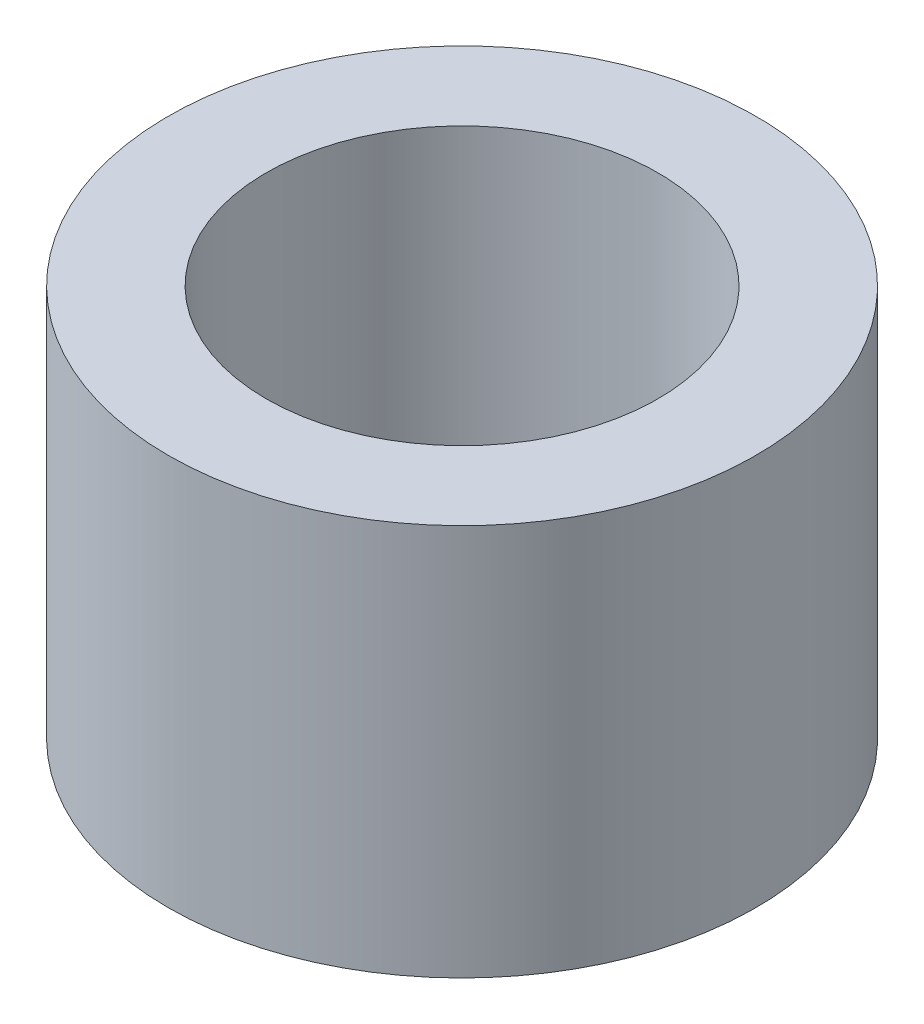
ISO-10303-21;
HEADER;
FILE_DESCRIPTION(('STEP AP214'),'2;1');
FILE_NAME('part.step','',(''),(''),'','','');
FILE_SCHEMA(('AUTOMOTIVE_DESIGN { 1 0 10303 214 1 1 1 1 }'));
ENDSEC;
DATA;
#1=APPLICATION_CONTEXT('core data for automotive mechanical design processes');
#2=APPLICATION_PROTOCOL_DEFINITION('international standard','automotive_design',2000,#1);
#3=PRODUCT_CONTEXT('',#1,'mechanical');
#4=PRODUCT('Part','Part','',(#3));
#5=PRODUCT_RELATED_PRODUCT_CATEGORY('part','',(#4));
#6=PRODUCT_DEFINITION_FORMATION('','',#4);
#7=PRODUCT_DEFINITION_CONTEXT('part definition',#1,'design');
#8=PRODUCT_DEFINITION('design','',#6,#7);
#9=PRODUCT_DEFINITION_SHAPE('','',#8);
#10=(LENGTH_UNIT() NAMED_UNIT(*) SI_UNIT(.MILLI.,.METRE.));
#11=(NAMED_UNIT(*) PLANE_ANGLE_UNIT() SI_UNIT($,.RADIAN.));
#12=(NAMED_UNIT(*) SI_UNIT($,.STERADIAN.) SOLID_ANGLE_UNIT());
#13=UNCERTAINTY_MEASURE_WITH_UNIT(LENGTH_MEASURE(1.E-05),#10,'distance_accuracy_value','');
#14=(GEOMETRIC_REPRESENTATION_CONTEXT(3) GLOBAL_UNCERTAINTY_ASSIGNED_CONTEXT((#13)) GLOBAL_UNIT_ASSIGNED_CONTEXT((#10,
#11,#12)) REPRESENTATION_CONTEXT('',''));
#15=CARTESIAN_POINT('',(0.,0.,0.));
#16=DIRECTION('',(0.,0.,1.));
#17=DIRECTION('',(1.,0.,0.));
#18=AXIS2_PLACEMENT_3D('',#15,#16,#17);
#19=CARTESIAN_POINT('',(0.,4.,0.));
#20=DIRECTION('',(0.,1.,0.));
#21=DIRECTION('',(0.,0.,1.));
#22=AXIS2_PLACEMENT_3D('',#19,#20,#21);
#23=PLANE('',#22);
#24=CARTESIAN_POINT('',(0.,4.,0.));
#25=DIRECTION('',(0.,1.,0.));
#26=DIRECTION('',(0.,0.,1.));
#27=AXIS2_PLACEMENT_3D('',#24,#25,#26);
#28=CIRCLE('',#27,3.);
#29=CARTESIAN_POINT('',(0.,4.,3.));
#30=VERTEX_POINT('',#29);
#31=EDGE_CURVE('E10',#30,#30,#28,.T.);
#32=ORIENTED_EDGE('',*,*,#31,.T.);
#33=EDGE_LOOP('',(#32));
#34=FACE_BOUND('',#33,.T.);
#35=CARTESIAN_POINT('',(0.,4.,0.));
#36=DIRECTION('',(0.,1.,0.));
#37=DIRECTION('',(0.,0.,1.));
#38=AXIS2_PLACEMENT_3D('',#35,#36,#37);
#39=CIRCLE('',#38,2.);
#40=CARTESIAN_POINT('',(0.,4.,2.));
#41=VERTEX_POINT('',#40);
#42=EDGE_CURVE('E56',#41,#41,#39,.T.);
#43=ORIENTED_EDGE('',*,*,#42,.F.);
#44=EDGE_LOOP('',(#43));
#45=FACE_BOUND('',#44,.T.);
#46=ADVANCED_FACE('F43',(#34,#45),#23,.T.);
#47=CARTESIAN_POINT('',(0.,0.,0.));
#48=DIRECTION('',(0.,1.,0.));
#49=DIRECTION('',(0.,0.,1.));
#50=AXIS2_PLACEMENT_3D('',#47,#48,#49);
#51=PLANE('',#50);
#52=CARTESIAN_POINT('',(0.,0.,0.));
#53=DIRECTION('',(0.,1.,0.));
#54=DIRECTION('',(0.,0.,1.));
#55=AXIS2_PLACEMENT_3D('',#52,#53,#54);
#56=CIRCLE('',#55,3.);
#57=CARTESIAN_POINT('',(0.,0.,3.));
#58=VERTEX_POINT('',#57);
#59=EDGE_CURVE('E47',#58,#58,#56,.T.);
#60=ORIENTED_EDGE('',*,*,#59,.F.);
#61=EDGE_LOOP('',(#60));
#62=FACE_BOUND('',#61,.T.);
#63=CARTESIAN_POINT('',(0.,0.,0.));
#64=DIRECTION('',(0.,1.,0.));
#65=DIRECTION('',(0.,0.,1.));
#66=AXIS2_PLACEMENT_3D('',#63,#64,#65);
#67=CIRCLE('',#66,2.);
#68=CARTESIAN_POINT('',(0.,0.,2.));
#69=VERTEX_POINT('',#68);
#70=EDGE_CURVE('E58',#69,#69,#67,.T.);
#71=ORIENTED_EDGE('',*,*,#70,.T.);
#72=EDGE_LOOP('',(#71));
#73=FACE_BOUND('',#72,.T.);
#74=ADVANCED_FACE('F70',(#62,#73),#51,.F.);
#75=CARTESIAN_POINT('',(0.,4.,0.));
#76=DIRECTION('',(0.,-1.,0.));
#77=DIRECTION('',(0.,0.,-1.));
#78=AXIS2_PLACEMENT_3D('',#75,#76,#77);
#79=CYLINDRICAL_SURFACE('',#78,3.);
#80=ORIENTED_EDGE('',*,*,#31,.F.);
#81=EDGE_LOOP('',(#80));
#82=FACE_BOUND('',#81,.T.);
#83=ORIENTED_EDGE('',*,*,#59,.T.);
#84=EDGE_LOOP('',(#83));
#85=FACE_BOUND('',#84,.T.);
#86=ADVANCED_FACE('F45',(#82,#85),#79,.T.);
#87=CARTESIAN_POINT('',(0.,4.,0.));
#88=DIRECTION('',(0.,-1.,0.));
#89=DIRECTION('',(0.,0.,-1.));
#90=AXIS2_PLACEMENT_3D('',#87,#88,#89);
#91=CYLINDRICAL_SURFACE('',#90,2.);
#92=ORIENTED_EDGE('',*,*,#42,.T.);
#93=EDGE_LOOP('',(#92));
#94=FACE_BOUND('',#93,.T.);
#95=ORIENTED_EDGE('',*,*,#70,.F.);
#96=EDGE_LOOP('',(#95));
#97=FACE_BOUND('',#96,.T.);
#98=ADVANCED_FACE('F66',(#94,#97),#91,.F.);
#99=CLOSED_SHELL('',(#46,#74,#86,#98));
#100=MANIFOLD_SOLID_BREP('B2',#99);
#101=ADVANCED_BREP_SHAPE_REPRESENTATION('',(#18,#100),#14);
#102=SHAPE_DEFINITION_REPRESENTATION(#9,#101);
ENDSEC;
END-ISO-10303-21;
